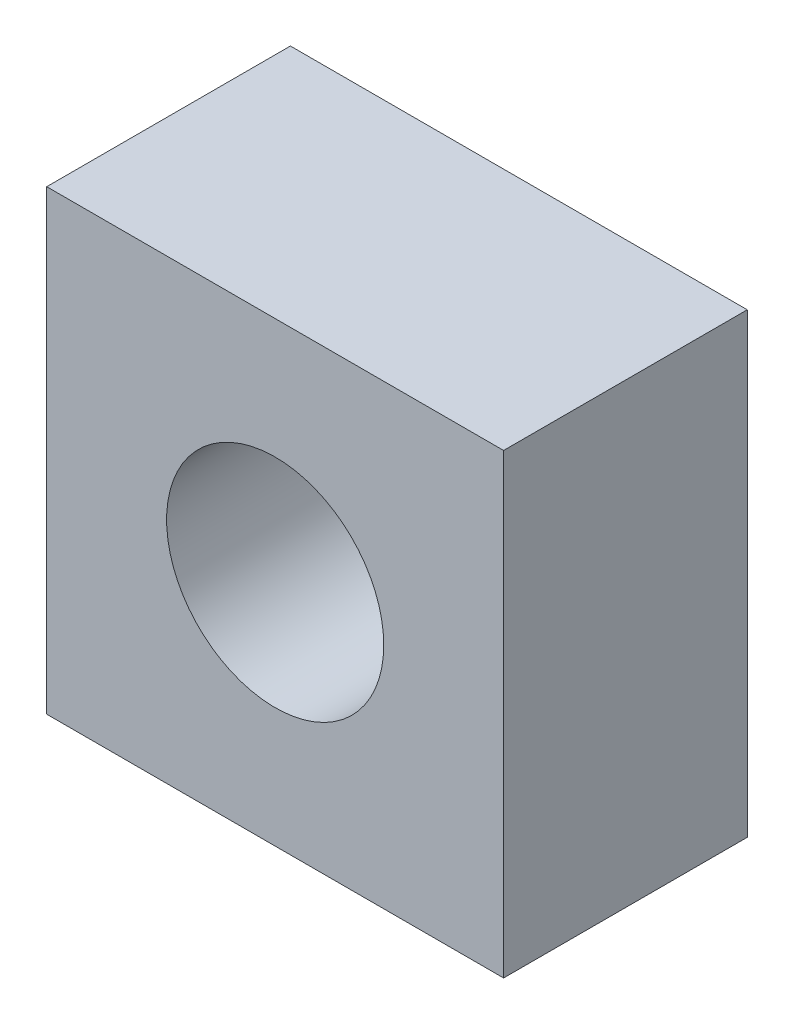
ISO-10303-21;
HEADER;
FILE_DESCRIPTION(('STEP AP214'),'2;1');
FILE_NAME('part.step','',(''),(''),'','','');
FILE_SCHEMA(('AUTOMOTIVE_DESIGN { 1 0 10303 214 1 1 1 1 }'));
ENDSEC;
DATA;
#1=APPLICATION_CONTEXT('core data for automotive mechanical design processes');
#2=APPLICATION_PROTOCOL_DEFINITION('international standard','automotive_design',2000,#1);
#3=PRODUCT_CONTEXT('',#1,'mechanical');
#4=PRODUCT('Part','Part','',(#3));
#5=PRODUCT_RELATED_PRODUCT_CATEGORY('part','',(#4));
#6=PRODUCT_DEFINITION_FORMATION('','',#4);
#7=PRODUCT_DEFINITION_CONTEXT('part definition',#1,'design');
#8=PRODUCT_DEFINITION('design','',#6,#7);
#9=PRODUCT_DEFINITION_SHAPE('','',#8);
#10=(LENGTH_UNIT() NAMED_UNIT(*) SI_UNIT(.MILLI.,.METRE.));
#11=(NAMED_UNIT(*) PLANE_ANGLE_UNIT() SI_UNIT($,.RADIAN.));
#12=(NAMED_UNIT(*) SI_UNIT($,.STERADIAN.) SOLID_ANGLE_UNIT());
#13=UNCERTAINTY_MEASURE_WITH_UNIT(LENGTH_MEASURE(1.E-05),#10,'distance_accuracy_value','');
#14=(GEOMETRIC_REPRESENTATION_CONTEXT(3) GLOBAL_UNCERTAINTY_ASSIGNED_CONTEXT((#13)) GLOBAL_UNIT_ASSIGNED_CONTEXT((#10,
#11,#12)) REPRESENTATION_CONTEXT('',''));
#15=CARTESIAN_POINT('',(0.,0.,0.));
#16=DIRECTION('',(0.,0.,1.));
#17=DIRECTION('',(1.,0.,0.));
#18=AXIS2_PLACEMENT_3D('',#15,#16,#17);
#19=CARTESIAN_POINT('',(0.005,0.,0.3));
#20=DIRECTION('',(0.,0.,1.));
#21=DIRECTION('',(-1.,0.,0.));
#22=AXIS2_PLACEMENT_3D('',#19,#20,#21);
#23=CYLINDRICAL_SURFACE('',#22,0.03564348885832);
#24=CARTESIAN_POINT('',(0.005,0.,0.38));
#25=DIRECTION('',(0.,0.,-1.));
#26=DIRECTION('',(-1.,0.,0.));
#27=AXIS2_PLACEMENT_3D('',#24,#25,#26);
#28=CIRCLE('',#27,0.03564348885832);
#29=CARTESIAN_POINT('',(0.04064348885832,0.,0.38));
#30=VERTEX_POINT('',#29);
#31=EDGE_CURVE('E101',#30,#30,#28,.T.);
#32=ORIENTED_EDGE('',*,*,#31,.F.);
#33=DIRECTION('',(0.,0.,-1.));
#34=VECTOR('',#33,1.);
#35=CARTESIAN_POINT('',(0.04064348885832,0.,0.3));
#36=LINE('',#35,#34);
#37=CARTESIAN_POINT('',(0.04064348885832,0.,0.3));
#38=VERTEX_POINT('',#37);
#39=EDGE_CURVE('E11',#30,#38,#36,.T.);
#40=ORIENTED_EDGE('',*,*,#39,.T.);
#41=CARTESIAN_POINT('',(0.005,0.,0.3));
#42=DIRECTION('',(0.,0.,-1.));
#43=DIRECTION('',(-1.,0.,0.));
#44=AXIS2_PLACEMENT_3D('',#41,#42,#43);
#45=CIRCLE('',#44,0.03564348885832);
#46=EDGE_CURVE('E107',#38,#38,#45,.T.);
#47=ORIENTED_EDGE('',*,*,#46,.T.);
#48=ORIENTED_EDGE('',*,*,#39,.F.);
#49=EDGE_LOOP('',(#32,#40,#47,#48));
#50=FACE_BOUND('',#49,.T.);
#51=ADVANCED_FACE('F17',(#50),#23,.F.);
#52=CARTESIAN_POINT('',(0.07999999832362,-0.07499999832362,0.3));
#53=DIRECTION('',(1.,0.,0.));
#54=DIRECTION('',(0.,1.,0.));
#55=AXIS2_PLACEMENT_3D('',#52,#53,#54);
#56=PLANE('',#55);
#57=DIRECTION('',(0.,-1.,0.));
#58=VECTOR('',#57,1.);
#59=CARTESIAN_POINT('',(0.07999999832362,0.07499999832362,0.3));
#60=LINE('',#59,#58);
#61=CARTESIAN_POINT('',(0.07999999832362,0.07499999832362,0.3));
#62=VERTEX_POINT('',#61);
#63=CARTESIAN_POINT('',(0.07999999832362,-0.07499999832362,0.3));
#64=VERTEX_POINT('',#63);
#65=EDGE_CURVE('E106',#62,#64,#60,.T.);
#66=ORIENTED_EDGE('',*,*,#65,.F.);
#67=DIRECTION('',(0.,0.,1.));
#68=VECTOR('',#67,1.);
#69=CARTESIAN_POINT('',(0.07999999832362,0.07499999832362,0.3));
#70=LINE('',#69,#68);
#71=CARTESIAN_POINT('',(0.07999999832362,0.07499999832362,0.38));
#72=VERTEX_POINT('',#71);
#73=EDGE_CURVE('E90',#62,#72,#70,.T.);
#74=ORIENTED_EDGE('',*,*,#73,.T.);
#75=DIRECTION('',(0.,1.,0.));
#76=VECTOR('',#75,1.);
#77=CARTESIAN_POINT('',(0.07999999832362,0.07499999832362,0.38));
#78=LINE('',#77,#76);
#79=CARTESIAN_POINT('',(0.07999999832362,-0.07499999832362,0.38));
#80=VERTEX_POINT('',#79);
#81=EDGE_CURVE('E91',#80,#72,#78,.T.);
#82=ORIENTED_EDGE('',*,*,#81,.F.);
#83=DIRECTION('',(0.,0.,1.));
#84=VECTOR('',#83,1.);
#85=CARTESIAN_POINT('',(0.07999999832362,-0.07499999832362,0.3));
#86=LINE('',#85,#84);
#87=EDGE_CURVE('E21',#64,#80,#86,.T.);
#88=ORIENTED_EDGE('',*,*,#87,.F.);
#89=EDGE_LOOP('',(#66,#74,#82,#88));
#90=FACE_BOUND('',#89,.T.);
#91=ADVANCED_FACE('F157',(#90),#56,.T.);
#92=CARTESIAN_POINT('',(-0.06999999832362,-0.07499999832362,0.3));
#93=DIRECTION('',(0.,-1.,0.));
#94=DIRECTION('',(0.,0.,-1.));
#95=AXIS2_PLACEMENT_3D('',#92,#93,#94);
#96=PLANE('',#95);
#97=DIRECTION('',(-1.,0.,0.));
#98=VECTOR('',#97,1.);
#99=CARTESIAN_POINT('',(0.07999999832362,-0.07499999832362,0.3));
#100=LINE('',#99,#98);
#101=CARTESIAN_POINT('',(-0.06999999832362,-0.07499999832362,0.3));
#102=VERTEX_POINT('',#101);
#103=EDGE_CURVE('E99',#64,#102,#100,.T.);
#104=ORIENTED_EDGE('',*,*,#103,.F.);
#105=ORIENTED_EDGE('',*,*,#87,.T.);
#106=DIRECTION('',(1.,0.,0.));
#107=VECTOR('',#106,1.);
#108=CARTESIAN_POINT('',(0.07999999832362,-0.07499999832362,0.38));
#109=LINE('',#108,#107);
#110=CARTESIAN_POINT('',(-0.06999999832362,-0.07499999832362,0.38));
#111=VERTEX_POINT('',#110);
#112=EDGE_CURVE('E129',#111,#80,#109,.T.);
#113=ORIENTED_EDGE('',*,*,#112,.F.);
#114=DIRECTION('',(0.,0.,1.));
#115=VECTOR('',#114,1.);
#116=CARTESIAN_POINT('',(-0.06999999832362,-0.07499999832362,0.3));
#117=LINE('',#116,#115);
#118=EDGE_CURVE('E126',#102,#111,#117,.T.);
#119=ORIENTED_EDGE('',*,*,#118,.F.);
#120=EDGE_LOOP('',(#104,#105,#113,#119));
#121=FACE_BOUND('',#120,.T.);
#122=ADVANCED_FACE('F162',(#121),#96,.T.);
#123=CARTESIAN_POINT('',(-0.06999999832362,0.07499999832362,0.3));
#124=DIRECTION('',(-1.,0.,0.));
#125=DIRECTION('',(0.,1.,0.));
#126=AXIS2_PLACEMENT_3D('',#123,#124,#125);
#127=PLANE('',#126);
#128=DIRECTION('',(0.,1.,0.));
#129=VECTOR('',#128,1.);
#130=CARTESIAN_POINT('',(-0.06999999832362,-0.07499999832362,0.3));
#131=LINE('',#130,#129);
#132=CARTESIAN_POINT('',(-0.06999999832362,0.07499999832362,0.3));
#133=VERTEX_POINT('',#132);
#134=EDGE_CURVE('E81',#102,#133,#131,.T.);
#135=ORIENTED_EDGE('',*,*,#134,.F.);
#136=ORIENTED_EDGE('',*,*,#118,.T.);
#137=DIRECTION('',(0.,-1.,0.));
#138=VECTOR('',#137,1.);
#139=CARTESIAN_POINT('',(-0.06999999832362,-0.07499999832362,0.38));
#140=LINE('',#139,#138);
#141=CARTESIAN_POINT('',(-0.06999999832362,0.07499999832362,0.38));
#142=VERTEX_POINT('',#141);
#143=EDGE_CURVE('E84',#142,#111,#140,.T.);
#144=ORIENTED_EDGE('',*,*,#143,.F.);
#145=DIRECTION('',(0.,0.,1.));
#146=VECTOR('',#145,1.);
#147=CARTESIAN_POINT('',(-0.06999999832362,0.07499999832362,0.3));
#148=LINE('',#147,#146);
#149=EDGE_CURVE('E79',#133,#142,#148,.T.);
#150=ORIENTED_EDGE('',*,*,#149,.F.);
#151=EDGE_LOOP('',(#135,#136,#144,#150));
#152=FACE_BOUND('',#151,.T.);
#153=ADVANCED_FACE('F19',(#152),#127,.T.);
#154=CARTESIAN_POINT('',(0.07999999832362,0.07499999832362,0.3));
#155=DIRECTION('',(0.,1.,0.));
#156=DIRECTION('',(1.,0.,0.));
#157=AXIS2_PLACEMENT_3D('',#154,#155,#156);
#158=PLANE('',#157);
#159=DIRECTION('',(1.,0.,0.));
#160=VECTOR('',#159,1.);
#161=CARTESIAN_POINT('',(-0.06999999832362,0.07499999832362,0.3));
#162=LINE('',#161,#160);
#163=EDGE_CURVE('E98',#133,#62,#162,.T.);
#164=ORIENTED_EDGE('',*,*,#163,.F.);
#165=ORIENTED_EDGE('',*,*,#149,.T.);
#166=DIRECTION('',(-1.,0.,0.));
#167=VECTOR('',#166,1.);
#168=CARTESIAN_POINT('',(-0.06999999832362,0.07499999832362,0.38));
#169=LINE('',#168,#167);
#170=EDGE_CURVE('E122',#72,#142,#169,.T.);
#171=ORIENTED_EDGE('',*,*,#170,.F.);
#172=ORIENTED_EDGE('',*,*,#73,.F.);
#173=EDGE_LOOP('',(#164,#165,#171,#172));
#174=FACE_BOUND('',#173,.T.);
#175=ADVANCED_FACE('F103',(#174),#158,.T.);
#176=CARTESIAN_POINT('',(0.005,0.,0.38));
#177=DIRECTION('',(0.,0.,1.));
#178=DIRECTION('',(1.,0.,0.));
#179=AXIS2_PLACEMENT_3D('',#176,#177,#178);
#180=PLANE('',#179);
#181=ORIENTED_EDGE('',*,*,#170,.T.);
#182=ORIENTED_EDGE('',*,*,#143,.T.);
#183=ORIENTED_EDGE('',*,*,#112,.T.);
#184=ORIENTED_EDGE('',*,*,#81,.T.);
#185=EDGE_LOOP('',(#181,#182,#183,#184));
#186=FACE_BOUND('',#185,.T.);
#187=ORIENTED_EDGE('',*,*,#31,.T.);
#188=EDGE_LOOP('',(#187));
#189=FACE_BOUND('',#188,.T.);
#190=ADVANCED_FACE('F144',(#186,#189),#180,.T.);
#191=CARTESIAN_POINT('',(0.005,0.,0.3));
#192=DIRECTION('',(0.,0.,1.));
#193=DIRECTION('',(1.,0.,0.));
#194=AXIS2_PLACEMENT_3D('',#191,#192,#193);
#195=PLANE('',#194);
#196=ORIENTED_EDGE('',*,*,#163,.T.);
#197=ORIENTED_EDGE('',*,*,#65,.T.);
#198=ORIENTED_EDGE('',*,*,#103,.T.);
#199=ORIENTED_EDGE('',*,*,#134,.T.);
#200=EDGE_LOOP('',(#196,#197,#198,#199));
#201=FACE_BOUND('',#200,.T.);
#202=ORIENTED_EDGE('',*,*,#46,.F.);
#203=EDGE_LOOP('',(#202));
#204=FACE_BOUND('',#203,.T.);
#205=ADVANCED_FACE('F95',(#201,#204),#195,.F.);
#206=CLOSED_SHELL('',(#51,#91,#122,#153,#175,#190,#205));
#207=MANIFOLD_SOLID_BREP('B1',#206);
#208=ADVANCED_BREP_SHAPE_REPRESENTATION('',(#18,#207),#14);
#209=SHAPE_DEFINITION_REPRESENTATION(#9,#208);
ENDSEC;
END-ISO-10303-21;
